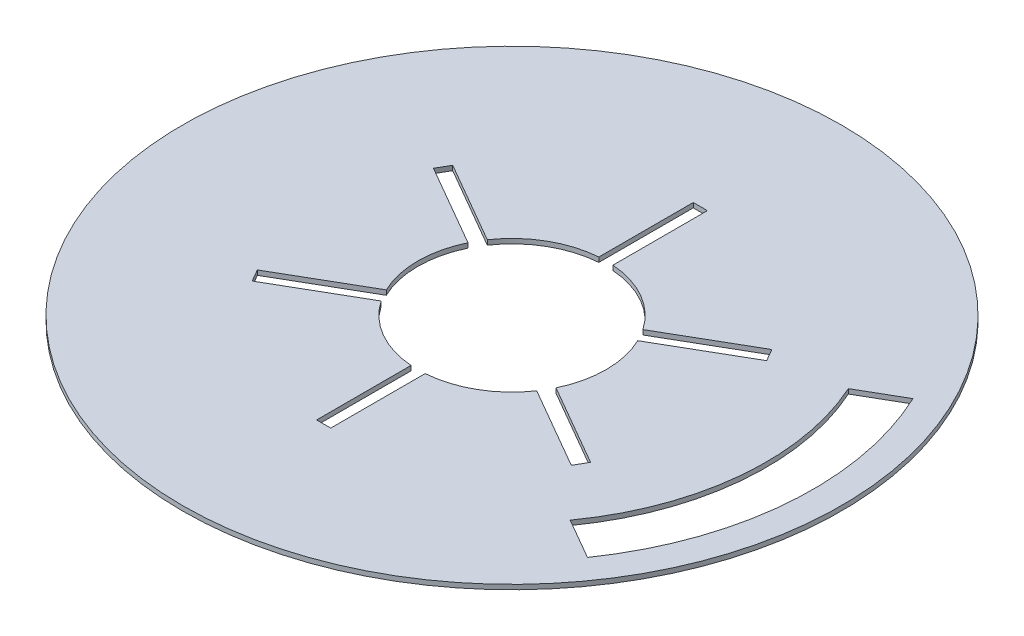
ISO-10303-21;
HEADER;
FILE_DESCRIPTION(('STEP AP214'),'2;1');
FILE_NAME('part.step','',(''),(''),'','','');
FILE_SCHEMA(('AUTOMOTIVE_DESIGN { 1 0 10303 214 1 1 1 1 }'));
ENDSEC;
DATA;
#1=APPLICATION_CONTEXT('core data for automotive mechanical design processes');
#2=APPLICATION_PROTOCOL_DEFINITION('international standard','automotive_design',2000,#1);
#3=PRODUCT_CONTEXT('',#1,'mechanical');
#4=PRODUCT('Part','Part','',(#3));
#5=PRODUCT_RELATED_PRODUCT_CATEGORY('part','',(#4));
#6=PRODUCT_DEFINITION_FORMATION('','',#4);
#7=PRODUCT_DEFINITION_CONTEXT('part definition',#1,'design');
#8=PRODUCT_DEFINITION('design','',#6,#7);
#9=PRODUCT_DEFINITION_SHAPE('','',#8);
#10=(LENGTH_UNIT() NAMED_UNIT(*) SI_UNIT(.MILLI.,.METRE.));
#11=(NAMED_UNIT(*) PLANE_ANGLE_UNIT() SI_UNIT($,.RADIAN.));
#12=(NAMED_UNIT(*) SI_UNIT($,.STERADIAN.) SOLID_ANGLE_UNIT());
#13=UNCERTAINTY_MEASURE_WITH_UNIT(LENGTH_MEASURE(1.E-05),#10,'distance_accuracy_value','');
#14=(GEOMETRIC_REPRESENTATION_CONTEXT(3) GLOBAL_UNCERTAINTY_ASSIGNED_CONTEXT((#13)) GLOBAL_UNIT_ASSIGNED_CONTEXT((#10,
#11,#12)) REPRESENTATION_CONTEXT('',''));
#15=CARTESIAN_POINT('',(0.,0.,0.));
#16=DIRECTION('',(0.,0.,1.));
#17=DIRECTION('',(1.,0.,0.));
#18=AXIS2_PLACEMENT_3D('',#15,#16,#17);
#19=CARTESIAN_POINT('',(13.3808283664911,5.,23.1762745781213));
#20=DIRECTION('',(-0.500000000000001,0.,-0.866025403784438));
#21=DIRECTION('',(-0.866025403784438,0.,0.500000000000001));
#22=AXIS2_PLACEMENT_3D('',#19,#20,#21);
#23=PLANE('',#22);
#24=DIRECTION('',(0.866025403784438,0.,-0.500000000000001));
#25=VECTOR('',#24,1.);
#26=CARTESIAN_POINT('',(13.3808283664911,0.,23.1762745781213));
#27=LINE('',#26,#25);
#28=CARTESIAN_POINT('',(246.056268189175,0.,-111.15895323732));
#29=VERTEX_POINT('',#28);
#30=CARTESIAN_POINT('',(289.538139145473,0.,-136.263223138808));
#31=VERTEX_POINT('',#30);
#32=EDGE_CURVE('E320',#29,#31,#27,.T.);
#33=ORIENTED_EDGE('',*,*,#32,.T.);
#34=DIRECTION('',(0.,-1.,0.));
#35=VECTOR('',#34,1.);
#36=CARTESIAN_POINT('',(289.538139145473,5.,-136.263223138808));
#37=LINE('',#36,#35);
#38=CARTESIAN_POINT('',(289.538139145473,5.,-136.263223138808));
#39=VERTEX_POINT('',#38);
#40=EDGE_CURVE('E11',#39,#31,#37,.T.);
#41=ORIENTED_EDGE('',*,*,#40,.F.);
#42=DIRECTION('',(0.866025403784438,0.,-0.500000000000001));
#43=VECTOR('',#42,1.);
#44=CARTESIAN_POINT('',(13.3808283664911,5.,23.1762745781213));
#45=LINE('',#44,#43);
#46=CARTESIAN_POINT('',(246.056268189175,5.,-111.15895323732));
#47=VERTEX_POINT('',#46);
#48=EDGE_CURVE('E234',#47,#39,#45,.T.);
#49=ORIENTED_EDGE('',*,*,#48,.F.);
#50=DIRECTION('',(0.,-1.,0.));
#51=VECTOR('',#50,1.);
#52=CARTESIAN_POINT('',(246.056268189175,5.,-111.15895323732));
#53=LINE('',#52,#51);
#54=EDGE_CURVE('E54',#47,#29,#53,.T.);
#55=ORIENTED_EDGE('',*,*,#54,.T.);
#56=EDGE_LOOP('',(#33,#41,#49,#55));
#57=FACE_BOUND('',#56,.T.);
#58=ADVANCED_FACE('F35',(#57),#23,.F.);
#59=CARTESIAN_POINT('',(0.,5.,0.));
#60=DIRECTION('',(0.,-1.,0.));
#61=DIRECTION('',(0.,0.,-1.));
#62=AXIS2_PLACEMENT_3D('',#59,#60,#61);
#63=CYLINDRICAL_SURFACE('',#62,320.);
#64=CARTESIAN_POINT('',(0.,0.,0.));
#65=DIRECTION('',(0.,1.,0.));
#66=DIRECTION('',(0.,0.,1.));
#67=AXIS2_PLACEMENT_3D('',#64,#65,#66);
#68=CIRCLE('',#67,320.);
#69=CARTESIAN_POINT('',(262.776482412492,0.,182.615772295049));
#70=VERTEX_POINT('',#69);
#71=EDGE_CURVE('E240',#31,#70,#68,.F.);
#72=ORIENTED_EDGE('',*,*,#71,.T.);
#73=DIRECTION('',(0.,-1.,0.));
#74=VECTOR('',#73,1.);
#75=CARTESIAN_POINT('',(262.776482412492,5.,182.615772295049));
#76=LINE('',#75,#74);
#77=CARTESIAN_POINT('',(262.776482412492,5.,182.615772295049));
#78=VERTEX_POINT('',#77);
#79=EDGE_CURVE('E45',#78,#70,#76,.T.);
#80=ORIENTED_EDGE('',*,*,#79,.F.);
#81=CARTESIAN_POINT('',(0.,5.,0.));
#82=DIRECTION('',(0.,1.,0.));
#83=DIRECTION('',(0.,0.,1.));
#84=AXIS2_PLACEMENT_3D('',#81,#82,#83);
#85=CIRCLE('',#84,320.);
#86=EDGE_CURVE('E228',#39,#78,#85,.F.);
#87=ORIENTED_EDGE('',*,*,#86,.F.);
#88=ORIENTED_EDGE('',*,*,#40,.T.);
#89=EDGE_LOOP('',(#72,#80,#87,#88));
#90=FACE_BOUND('',#89,.T.);
#91=ADVANCED_FACE('F239',(#90),#63,.F.);
#92=CARTESIAN_POINT('',(-13.3808283664908,5.,23.1762745781209));
#93=DIRECTION('',(0.5,0.,-0.866025403784439));
#94=DIRECTION('',(-0.866025403784439,0.,-0.5));
#95=AXIS2_PLACEMENT_3D('',#92,#93,#94);
#96=PLANE('',#95);
#97=DIRECTION('',(0.866025403784439,0.,0.5));
#98=VECTOR('',#97,1.);
#99=CARTESIAN_POINT('',(-13.3808283664908,0.,23.1762745781209));
#100=LINE('',#99,#98);
#101=CARTESIAN_POINT('',(219.294611456193,0.,157.511502393562));
#102=VERTEX_POINT('',#101);
#103=EDGE_CURVE('E323',#102,#70,#100,.T.);
#104=ORIENTED_EDGE('',*,*,#103,.F.);
#105=DIRECTION('',(0.,-1.,0.));
#106=VECTOR('',#105,1.);
#107=CARTESIAN_POINT('',(219.294611456193,5.,157.511502393562));
#108=LINE('',#107,#106);
#109=CARTESIAN_POINT('',(219.294611456193,5.,157.511502393562));
#110=VERTEX_POINT('',#109);
#111=EDGE_CURVE('E140',#110,#102,#108,.T.);
#112=ORIENTED_EDGE('',*,*,#111,.F.);
#113=DIRECTION('',(0.866025403784439,0.,0.5));
#114=VECTOR('',#113,1.);
#115=CARTESIAN_POINT('',(-13.3808283664908,5.,23.1762745781209));
#116=LINE('',#115,#114);
#117=EDGE_CURVE('E233',#110,#78,#116,.T.);
#118=ORIENTED_EDGE('',*,*,#117,.T.);
#119=ORIENTED_EDGE('',*,*,#79,.T.);
#120=EDGE_LOOP('',(#104,#112,#118,#119));
#121=FACE_BOUND('',#120,.T.);
#122=ADVANCED_FACE('F244',(#121),#96,.T.);
#123=CARTESIAN_POINT('',(0.,5.,0.));
#124=DIRECTION('',(0.,-1.,0.));
#125=DIRECTION('',(0.,0.,-1.));
#126=AXIS2_PLACEMENT_3D('',#123,#124,#125);
#127=CYLINDRICAL_SURFACE('',#126,100.);
#128=CARTESIAN_POINT('',(0.,0.,0.));
#129=DIRECTION('',(0.,1.,0.));
#130=DIRECTION('',(0.,0.,1.));
#131=AXIS2_PLACEMENT_3D('',#128,#129,#130);
#132=CIRCLE('',#131,100.);
#133=CARTESIAN_POINT('',(-82.6086272470793,0.,56.3543672163311));
#134=VERTEX_POINT('',#133);
#135=CARTESIAN_POINT('',(-7.5,0.,99.7183533758957));
#136=VERTEX_POINT('',#135);
#137=EDGE_CURVE('E251',#134,#136,#132,.T.);
#138=ORIENTED_EDGE('',*,*,#137,.F.);
#139=DIRECTION('',(0.,-1.,0.));
#140=VECTOR('',#139,1.);
#141=CARTESIAN_POINT('',(-82.6086272470793,5.,56.3543672163311));
#142=LINE('',#141,#140);
#143=CARTESIAN_POINT('',(-82.6086272470793,5.,56.3543672163311));
#144=VERTEX_POINT('',#143);
#145=EDGE_CURVE('E39',#144,#134,#142,.T.);
#146=ORIENTED_EDGE('',*,*,#145,.F.);
#147=CARTESIAN_POINT('',(0.,5.,0.));
#148=DIRECTION('',(0.,1.,0.));
#149=DIRECTION('',(0.,0.,1.));
#150=AXIS2_PLACEMENT_3D('',#147,#148,#149);
#151=CIRCLE('',#150,100.);
#152=CARTESIAN_POINT('',(-7.5,5.,99.7183533758957));
#153=VERTEX_POINT('',#152);
#154=EDGE_CURVE('E328',#144,#153,#151,.T.);
#155=ORIENTED_EDGE('',*,*,#154,.T.);
#156=DIRECTION('',(0.,-1.,0.));
#157=VECTOR('',#156,1.);
#158=CARTESIAN_POINT('',(-7.5,5.,99.7183533758957));
#159=LINE('',#158,#157);
#160=EDGE_CURVE('E247',#153,#136,#159,.T.);
#161=ORIENTED_EDGE('',*,*,#160,.T.);
#162=EDGE_LOOP('',(#138,#146,#155,#161));
#163=FACE_BOUND('',#162,.T.);
#164=ADVANCED_FACE('F37',(#163),#127,.F.);
#165=CARTESIAN_POINT('',(3.75000000000001,5.,6.4951905283833));
#166=DIRECTION('',(0.5,0.,0.866025403784438));
#167=DIRECTION('',(0.866025403784438,0.,-0.5));
#168=AXIS2_PLACEMENT_3D('',#165,#166,#167);
#169=PLANE('',#168);
#170=DIRECTION('',(-0.866025403784438,0.,0.5));
#171=VECTOR('',#170,1.);
#172=CARTESIAN_POINT('',(3.75000000000001,0.,6.4951905283833));
#173=LINE('',#172,#171);
#174=CARTESIAN_POINT('',(-169.455080756888,0.,106.495190528383));
#175=VERTEX_POINT('',#174);
#176=EDGE_CURVE('E254',#134,#175,#173,.T.);
#177=ORIENTED_EDGE('',*,*,#176,.T.);
#178=DIRECTION('',(0.,-1.,0.));
#179=VECTOR('',#178,1.);
#180=CARTESIAN_POINT('',(-169.455080756888,5.,106.495190528383));
#181=LINE('',#180,#179);
#182=CARTESIAN_POINT('',(-169.455080756888,5.,106.495190528383));
#183=VERTEX_POINT('',#182);
#184=EDGE_CURVE('E378',#183,#175,#181,.T.);
#185=ORIENTED_EDGE('',*,*,#184,.F.);
#186=DIRECTION('',(-0.866025403784438,0.,0.5));
#187=VECTOR('',#186,1.);
#188=CARTESIAN_POINT('',(3.75000000000001,5.,6.4951905283833));
#189=LINE('',#188,#187);
#190=EDGE_CURVE('E387',#144,#183,#189,.T.);
#191=ORIENTED_EDGE('',*,*,#190,.F.);
#192=ORIENTED_EDGE('',*,*,#145,.T.);
#193=EDGE_LOOP('',(#177,#185,#191,#192));
#194=FACE_BOUND('',#193,.T.);
#195=ADVANCED_FACE('F386',(#194),#169,.F.);
#196=CARTESIAN_POINT('',(-173.205080756888,5.,100.));
#197=DIRECTION('',(-0.866025403784438,0.,0.5));
#198=DIRECTION('',(0.5,0.,0.866025403784438));
#199=AXIS2_PLACEMENT_3D('',#196,#197,#198);
#200=PLANE('',#199);
#201=DIRECTION('',(-0.5,0.,-0.866025403784438));
#202=VECTOR('',#201,1.);
#203=CARTESIAN_POINT('',(-173.205080756888,0.,100.));
#204=LINE('',#203,#202);
#205=CARTESIAN_POINT('',(-176.955080756888,0.,93.5048094716168));
#206=VERTEX_POINT('',#205);
#207=EDGE_CURVE('E256',#175,#206,#204,.T.);
#208=ORIENTED_EDGE('',*,*,#207,.T.);
#209=DIRECTION('',(0.,-1.,0.));
#210=VECTOR('',#209,1.);
#211=CARTESIAN_POINT('',(-176.955080756888,5.,93.5048094716168));
#212=LINE('',#211,#210);
#213=CARTESIAN_POINT('',(-176.955080756888,5.,93.5048094716168));
#214=VERTEX_POINT('',#213);
#215=EDGE_CURVE('E377',#214,#206,#212,.T.);
#216=ORIENTED_EDGE('',*,*,#215,.F.);
#217=DIRECTION('',(-0.5,0.,-0.866025403784438));
#218=VECTOR('',#217,1.);
#219=CARTESIAN_POINT('',(-173.205080756888,5.,100.));
#220=LINE('',#219,#218);
#221=EDGE_CURVE('E833',#183,#214,#220,.T.);
#222=ORIENTED_EDGE('',*,*,#221,.F.);
#223=ORIENTED_EDGE('',*,*,#184,.T.);
#224=EDGE_LOOP('',(#208,#216,#222,#223));
#225=FACE_BOUND('',#224,.T.);
#226=ADVANCED_FACE('F517',(#225),#200,.F.);
#227=CARTESIAN_POINT('',(-3.75,5.,-6.49519052838328));
#228=DIRECTION('',(0.5,0.,0.866025403784438));
#229=DIRECTION('',(0.866025403784438,0.,-0.5));
#230=AXIS2_PLACEMENT_3D('',#227,#228,#229);
#231=PLANE('',#230);
#232=DIRECTION('',(-0.866025403784438,0.,0.5));
#233=VECTOR('',#232,1.);
#234=CARTESIAN_POINT('',(-3.75,0.,-6.49519052838328));
#235=LINE('',#234,#233);
#236=CARTESIAN_POINT('',(-90.1086272470794,0.,43.3639861595646));
#237=VERTEX_POINT('',#236);
#238=EDGE_CURVE('E259',#237,#206,#235,.T.);
#239=ORIENTED_EDGE('',*,*,#238,.F.);
#240=DIRECTION('',(0.,-1.,0.));
#241=VECTOR('',#240,1.);
#242=CARTESIAN_POINT('',(-90.1086272470794,5.,43.3639861595646));
#243=LINE('',#242,#241);
#244=CARTESIAN_POINT('',(-90.1086272470794,5.,43.3639861595646));
#245=VERTEX_POINT('',#244);
#246=EDGE_CURVE('E375',#245,#237,#243,.T.);
#247=ORIENTED_EDGE('',*,*,#246,.F.);
#248=DIRECTION('',(-0.866025403784438,0.,0.5));
#249=VECTOR('',#248,1.);
#250=CARTESIAN_POINT('',(-3.75,5.,-6.49519052838328));
#251=LINE('',#250,#249);
#252=EDGE_CURVE('E516',#245,#214,#251,.T.);
#253=ORIENTED_EDGE('',*,*,#252,.T.);
#254=ORIENTED_EDGE('',*,*,#215,.T.);
#255=EDGE_LOOP('',(#239,#247,#253,#254));
#256=FACE_BOUND('',#255,.T.);
#257=ADVANCED_FACE('F512',(#256),#231,.T.);
#258=CARTESIAN_POINT('',(0.,5.,0.));
#259=DIRECTION('',(0.,-1.,0.));
#260=DIRECTION('',(0.,0.,-1.));
#261=AXIS2_PLACEMENT_3D('',#258,#259,#260);
#262=CYLINDRICAL_SURFACE('',#261,100.);
#263=CARTESIAN_POINT('',(0.,0.,0.));
#264=DIRECTION('',(0.,1.,0.));
#265=DIRECTION('',(0.,0.,1.));
#266=AXIS2_PLACEMENT_3D('',#263,#264,#265);
#267=CIRCLE('',#266,100.);
#268=CARTESIAN_POINT('',(-90.1086272470794,0.,-43.3639861595645));
#269=VERTEX_POINT('',#268);
#270=EDGE_CURVE('E262',#269,#237,#267,.T.);
#271=ORIENTED_EDGE('',*,*,#270,.F.);
#272=DIRECTION('',(0.,-1.,0.));
#273=VECTOR('',#272,1.);
#274=CARTESIAN_POINT('',(-90.1086272470794,5.,-43.3639861595645));
#275=LINE('',#274,#273);
#276=CARTESIAN_POINT('',(-90.1086272470794,5.,-43.3639861595645));
#277=VERTEX_POINT('',#276);
#278=EDGE_CURVE('E373',#277,#269,#275,.T.);
#279=ORIENTED_EDGE('',*,*,#278,.F.);
#280=CARTESIAN_POINT('',(0.,5.,0.));
#281=DIRECTION('',(0.,1.,0.));
#282=DIRECTION('',(0.,0.,1.));
#283=AXIS2_PLACEMENT_3D('',#280,#281,#282);
#284=CIRCLE('',#283,100.);
#285=EDGE_CURVE('E509',#277,#245,#284,.T.);
#286=ORIENTED_EDGE('',*,*,#285,.T.);
#287=ORIENTED_EDGE('',*,*,#246,.T.);
#288=EDGE_LOOP('',(#271,#279,#286,#287));
#289=FACE_BOUND('',#288,.T.);
#290=ADVANCED_FACE('F508',(#289),#262,.F.);
#291=CARTESIAN_POINT('',(-3.75,5.,6.4951905283833));
#292=DIRECTION('',(-0.499999999999999,0.,0.866025403784439));
#293=DIRECTION('',(0.866025403784439,0.,0.499999999999999));
#294=AXIS2_PLACEMENT_3D('',#291,#292,#293);
#295=PLANE('',#294);
#296=DIRECTION('',(-0.866025403784439,0.,-0.499999999999999));
#297=VECTOR('',#296,1.);
#298=CARTESIAN_POINT('',(-3.75,0.,6.4951905283833));
#299=LINE('',#298,#297);
#300=CARTESIAN_POINT('',(-176.955080756888,0.,-93.5048094716166));
#301=VERTEX_POINT('',#300);
#302=EDGE_CURVE('E265',#269,#301,#299,.T.);
#303=ORIENTED_EDGE('',*,*,#302,.T.);
#304=DIRECTION('',(0.,-1.,0.));
#305=VECTOR('',#304,1.);
#306=CARTESIAN_POINT('',(-176.955080756888,5.,-93.5048094716166));
#307=LINE('',#306,#305);
#308=CARTESIAN_POINT('',(-176.955080756888,5.,-93.5048094716166));
#309=VERTEX_POINT('',#308);
#310=EDGE_CURVE('E370',#309,#301,#307,.T.);
#311=ORIENTED_EDGE('',*,*,#310,.F.);
#312=DIRECTION('',(-0.866025403784439,0.,-0.499999999999999));
#313=VECTOR('',#312,1.);
#314=CARTESIAN_POINT('',(-3.75,5.,6.4951905283833));
#315=LINE('',#314,#313);
#316=EDGE_CURVE('E504',#277,#309,#315,.T.);
#317=ORIENTED_EDGE('',*,*,#316,.F.);
#318=ORIENTED_EDGE('',*,*,#278,.T.);
#319=EDGE_LOOP('',(#303,#311,#317,#318));
#320=FACE_BOUND('',#319,.T.);
#321=ADVANCED_FACE('F503',(#320),#295,.F.);
#322=CARTESIAN_POINT('',(-173.205080756888,5.,-100.));
#323=DIRECTION('',(-0.866025403784439,0.,-0.5));
#324=DIRECTION('',(-0.5,0.,0.866025403784439));
#325=AXIS2_PLACEMENT_3D('',#322,#323,#324);
#326=PLANE('',#325);
#327=DIRECTION('',(0.5,0.,-0.866025403784439));
#328=VECTOR('',#327,1.);
#329=CARTESIAN_POINT('',(-173.205080756888,0.,-100.));
#330=LINE('',#329,#328);
#331=CARTESIAN_POINT('',(-169.455080756888,0.,-106.495190528383));
#332=VERTEX_POINT('',#331);
#333=EDGE_CURVE('E267',#301,#332,#330,.T.);
#334=ORIENTED_EDGE('',*,*,#333,.T.);
#335=DIRECTION('',(0.,-1.,0.));
#336=VECTOR('',#335,1.);
#337=CARTESIAN_POINT('',(-169.455080756888,5.,-106.495190528383));
#338=LINE('',#337,#336);
#339=CARTESIAN_POINT('',(-169.455080756888,5.,-106.495190528383));
#340=VERTEX_POINT('',#339);
#341=EDGE_CURVE('E368',#340,#332,#338,.T.);
#342=ORIENTED_EDGE('',*,*,#341,.F.);
#343=DIRECTION('',(0.5,0.,-0.866025403784439));
#344=VECTOR('',#343,1.);
#345=CARTESIAN_POINT('',(-173.205080756888,5.,-100.));
#346=LINE('',#345,#344);
#347=EDGE_CURVE('E500',#309,#340,#346,.T.);
#348=ORIENTED_EDGE('',*,*,#347,.F.);
#349=ORIENTED_EDGE('',*,*,#310,.T.);
#350=EDGE_LOOP('',(#334,#342,#348,#349));
#351=FACE_BOUND('',#350,.T.);
#352=ADVANCED_FACE('F497',(#351),#326,.F.);
#353=CARTESIAN_POINT('',(3.75000000000001,5.,-6.49519052838332));
#354=DIRECTION('',(-0.499999999999999,0.,0.866025403784439));
#355=DIRECTION('',(0.866025403784439,0.,0.499999999999999));
#356=AXIS2_PLACEMENT_3D('',#353,#354,#355);
#357=PLANE('',#356);
#358=DIRECTION('',(-0.866025403784439,0.,-0.499999999999999));
#359=VECTOR('',#358,1.);
#360=CARTESIAN_POINT('',(3.75000000000001,0.,-6.49519052838332));
#361=LINE('',#360,#359);
#362=CARTESIAN_POINT('',(-82.6086272470794,0.,-56.3543672163311));
#363=VERTEX_POINT('',#362);
#364=EDGE_CURVE('E270',#363,#332,#361,.T.);
#365=ORIENTED_EDGE('',*,*,#364,.F.);
#366=DIRECTION('',(0.,-1.,0.));
#367=VECTOR('',#366,1.);
#368=CARTESIAN_POINT('',(-82.6086272470794,5.,-56.3543672163311));
#369=LINE('',#368,#367);
#370=CARTESIAN_POINT('',(-82.6086272470794,5.,-56.3543672163311));
#371=VERTEX_POINT('',#370);
#372=EDGE_CURVE('E366',#371,#363,#369,.T.);
#373=ORIENTED_EDGE('',*,*,#372,.F.);
#374=DIRECTION('',(-0.866025403784439,0.,-0.499999999999999));
#375=VECTOR('',#374,1.);
#376=CARTESIAN_POINT('',(3.75000000000001,5.,-6.49519052838332));
#377=LINE('',#376,#375);
#378=EDGE_CURVE('E827',#371,#340,#377,.T.);
#379=ORIENTED_EDGE('',*,*,#378,.T.);
#380=ORIENTED_EDGE('',*,*,#341,.T.);
#381=EDGE_LOOP('',(#365,#373,#379,#380));
#382=FACE_BOUND('',#381,.T.);
#383=ADVANCED_FACE('F491',(#382),#357,.T.);
#384=CARTESIAN_POINT('',(0.,5.,0.));
#385=DIRECTION('',(0.,-1.,0.));
#386=DIRECTION('',(0.,0.,-1.));
#387=AXIS2_PLACEMENT_3D('',#384,#385,#386);
#388=CYLINDRICAL_SURFACE('',#387,100.);
#389=CARTESIAN_POINT('',(0.,0.,0.));
#390=DIRECTION('',(0.,1.,0.));
#391=DIRECTION('',(0.,0.,1.));
#392=AXIS2_PLACEMENT_3D('',#389,#390,#391);
#393=CIRCLE('',#392,100.);
#394=CARTESIAN_POINT('',(-7.5,0.,-99.7183533758957));
#395=VERTEX_POINT('',#394);
#396=EDGE_CURVE('E273',#395,#363,#393,.T.);
#397=ORIENTED_EDGE('',*,*,#396,.F.);
#398=DIRECTION('',(0.,-1.,0.));
#399=VECTOR('',#398,1.);
#400=CARTESIAN_POINT('',(-7.5,5.,-99.7183533758957));
#401=LINE('',#400,#399);
#402=CARTESIAN_POINT('',(-7.5,5.,-99.7183533758957));
#403=VERTEX_POINT('',#402);
#404=EDGE_CURVE('E364',#403,#395,#401,.T.);
#405=ORIENTED_EDGE('',*,*,#404,.F.);
#406=CARTESIAN_POINT('',(0.,5.,0.));
#407=DIRECTION('',(0.,1.,0.));
#408=DIRECTION('',(0.,0.,1.));
#409=AXIS2_PLACEMENT_3D('',#406,#407,#408);
#410=CIRCLE('',#409,100.);
#411=EDGE_CURVE('E487',#403,#371,#410,.T.);
#412=ORIENTED_EDGE('',*,*,#411,.T.);
#413=ORIENTED_EDGE('',*,*,#372,.T.);
#414=EDGE_LOOP('',(#397,#405,#412,#413));
#415=FACE_BOUND('',#414,.T.);
#416=ADVANCED_FACE('F484',(#415),#388,.F.);
#417=CARTESIAN_POINT('',(-7.5,5.,0.));
#418=DIRECTION('',(-1.,0.,0.));
#419=DIRECTION('',(0.,0.,1.));
#420=AXIS2_PLACEMENT_3D('',#417,#418,#419);
#421=PLANE('',#420);
#422=DIRECTION('',(0.,0.,-1.));
#423=VECTOR('',#422,1.);
#424=CARTESIAN_POINT('',(-7.5,0.,0.));
#425=LINE('',#424,#423);
#426=CARTESIAN_POINT('',(-7.5,0.,-200.));
#427=VERTEX_POINT('',#426);
#428=EDGE_CURVE('E276',#395,#427,#425,.T.);
#429=ORIENTED_EDGE('',*,*,#428,.T.);
#430=DIRECTION('',(0.,-1.,0.));
#431=VECTOR('',#430,1.);
#432=CARTESIAN_POINT('',(-7.5,5.,-200.));
#433=LINE('',#432,#431);
#434=CARTESIAN_POINT('',(-7.5,5.,-200.));
#435=VERTEX_POINT('',#434);
#436=EDGE_CURVE('E361',#435,#427,#433,.T.);
#437=ORIENTED_EDGE('',*,*,#436,.F.);
#438=DIRECTION('',(0.,0.,-1.));
#439=VECTOR('',#438,1.);
#440=CARTESIAN_POINT('',(-7.5,5.,0.));
#441=LINE('',#440,#439);
#442=EDGE_CURVE('E480',#403,#435,#441,.T.);
#443=ORIENTED_EDGE('',*,*,#442,.F.);
#444=ORIENTED_EDGE('',*,*,#404,.T.);
#445=EDGE_LOOP('',(#429,#437,#443,#444));
#446=FACE_BOUND('',#445,.T.);
#447=ADVANCED_FACE('F479',(#446),#421,.F.);
#448=CARTESIAN_POINT('',(0.,5.,-200.));
#449=DIRECTION('',(0.,0.,-1.));
#450=DIRECTION('',(-1.,0.,0.));
#451=AXIS2_PLACEMENT_3D('',#448,#449,#450);
#452=PLANE('',#451);
#453=DIRECTION('',(1.,0.,0.));
#454=VECTOR('',#453,1.);
#455=CARTESIAN_POINT('',(0.,0.,-200.));
#456=LINE('',#455,#454);
#457=CARTESIAN_POINT('',(7.5,0.,-200.));
#458=VERTEX_POINT('',#457);
#459=EDGE_CURVE('E278',#427,#458,#456,.T.);
#460=ORIENTED_EDGE('',*,*,#459,.T.);
#461=DIRECTION('',(0.,-1.,0.));
#462=VECTOR('',#461,1.);
#463=CARTESIAN_POINT('',(7.5,5.,-200.));
#464=LINE('',#463,#462);
#465=CARTESIAN_POINT('',(7.5,5.,-200.));
#466=VERTEX_POINT('',#465);
#467=EDGE_CURVE('E359',#466,#458,#464,.T.);
#468=ORIENTED_EDGE('',*,*,#467,.F.);
#469=DIRECTION('',(1.,0.,0.));
#470=VECTOR('',#469,1.);
#471=CARTESIAN_POINT('',(0.,5.,-200.));
#472=LINE('',#471,#470);
#473=EDGE_CURVE('E476',#435,#466,#472,.T.);
#474=ORIENTED_EDGE('',*,*,#473,.F.);
#475=ORIENTED_EDGE('',*,*,#436,.T.);
#476=EDGE_LOOP('',(#460,#468,#474,#475));
#477=FACE_BOUND('',#476,.T.);
#478=ADVANCED_FACE('F474',(#477),#452,.F.);
#479=CARTESIAN_POINT('',(7.50000000000005,5.,0.));
#480=DIRECTION('',(-1.,0.,0.));
#481=DIRECTION('',(0.,0.,1.));
#482=AXIS2_PLACEMENT_3D('',#479,#480,#481);
#483=PLANE('',#482);
#484=DIRECTION('',(0.,0.,-1.));
#485=VECTOR('',#484,1.);
#486=CARTESIAN_POINT('',(7.50000000000005,0.,0.));
#487=LINE('',#486,#485);
#488=CARTESIAN_POINT('',(7.50000000000002,0.,-99.7183533758957));
#489=VERTEX_POINT('',#488);
#490=EDGE_CURVE('E281',#489,#458,#487,.T.);
#491=ORIENTED_EDGE('',*,*,#490,.F.);
#492=DIRECTION('',(0.,-1.,0.));
#493=VECTOR('',#492,1.);
#494=CARTESIAN_POINT('',(7.50000000000002,5.,-99.7183533758957));
#495=LINE('',#494,#493);
#496=CARTESIAN_POINT('',(7.50000000000002,5.,-99.7183533758957));
#497=VERTEX_POINT('',#496);
#498=EDGE_CURVE('E357',#497,#489,#495,.T.);
#499=ORIENTED_EDGE('',*,*,#498,.F.);
#500=DIRECTION('',(0.,0.,-1.));
#501=VECTOR('',#500,1.);
#502=CARTESIAN_POINT('',(7.50000000000005,5.,0.));
#503=LINE('',#502,#501);
#504=EDGE_CURVE('E471',#497,#466,#503,.T.);
#505=ORIENTED_EDGE('',*,*,#504,.T.);
#506=ORIENTED_EDGE('',*,*,#467,.T.);
#507=EDGE_LOOP('',(#491,#499,#505,#506));
#508=FACE_BOUND('',#507,.T.);
#509=ADVANCED_FACE('F467',(#508),#483,.T.);
#510=CARTESIAN_POINT('',(0.,5.,0.));
#511=DIRECTION('',(0.,-1.,0.));
#512=DIRECTION('',(0.,0.,-1.));
#513=AXIS2_PLACEMENT_3D('',#510,#511,#512);
#514=CYLINDRICAL_SURFACE('',#513,100.);
#515=CARTESIAN_POINT('',(0.,0.,0.));
#516=DIRECTION('',(0.,1.,0.));
#517=DIRECTION('',(0.,0.,1.));
#518=AXIS2_PLACEMENT_3D('',#515,#516,#517);
#519=CIRCLE('',#518,100.);
#520=CARTESIAN_POINT('',(82.6086272470794,0.,-56.354367216331));
#521=VERTEX_POINT('',#520);
#522=EDGE_CURVE('E284',#521,#489,#519,.T.);
#523=ORIENTED_EDGE('',*,*,#522,.F.);
#524=DIRECTION('',(0.,-1.,0.));
#525=VECTOR('',#524,1.);
#526=CARTESIAN_POINT('',(82.6086272470794,5.,-56.354367216331));
#527=LINE('',#526,#525);
#528=CARTESIAN_POINT('',(82.6086272470794,5.,-56.354367216331));
#529=VERTEX_POINT('',#528);
#530=EDGE_CURVE('E355',#529,#521,#527,.T.);
#531=ORIENTED_EDGE('',*,*,#530,.F.);
#532=CARTESIAN_POINT('',(0.,5.,0.));
#533=DIRECTION('',(0.,1.,0.));
#534=DIRECTION('',(0.,0.,1.));
#535=AXIS2_PLACEMENT_3D('',#532,#533,#534);
#536=CIRCLE('',#535,100.);
#537=EDGE_CURVE('E462',#529,#497,#536,.T.);
#538=ORIENTED_EDGE('',*,*,#537,.T.);
#539=ORIENTED_EDGE('',*,*,#498,.T.);
#540=EDGE_LOOP('',(#523,#531,#538,#539));
#541=FACE_BOUND('',#540,.T.);
#542=ADVANCED_FACE('F461',(#541),#514,.F.);
#543=CARTESIAN_POINT('',(-3.7499999999999,5.,-6.49519052838311));
#544=DIRECTION('',(-0.500000000000001,0.,-0.866025403784438));
#545=DIRECTION('',(-0.866025403784438,0.,0.500000000000001));
#546=AXIS2_PLACEMENT_3D('',#543,#544,#545);
#547=PLANE('',#546);
#548=DIRECTION('',(0.866025403784438,0.,-0.500000000000001));
#549=VECTOR('',#548,1.);
#550=CARTESIAN_POINT('',(-3.7499999999999,0.,-6.49519052838311));
#551=LINE('',#550,#549);
#552=CARTESIAN_POINT('',(169.455080756888,0.,-106.495190528383));
#553=VERTEX_POINT('',#552);
#554=EDGE_CURVE('E287',#521,#553,#551,.T.);
#555=ORIENTED_EDGE('',*,*,#554,.T.);
#556=DIRECTION('',(0.,-1.,0.));
#557=VECTOR('',#556,1.);
#558=CARTESIAN_POINT('',(169.455080756888,5.,-106.495190528383));
#559=LINE('',#558,#557);
#560=CARTESIAN_POINT('',(169.455080756888,5.,-106.495190528383));
#561=VERTEX_POINT('',#560);
#562=EDGE_CURVE('E352',#561,#553,#559,.T.);
#563=ORIENTED_EDGE('',*,*,#562,.F.);
#564=DIRECTION('',(0.866025403784438,0.,-0.500000000000001));
#565=VECTOR('',#564,1.);
#566=CARTESIAN_POINT('',(-3.7499999999999,5.,-6.49519052838311));
#567=LINE('',#566,#565);
#568=EDGE_CURVE('E457',#529,#561,#567,.T.);
#569=ORIENTED_EDGE('',*,*,#568,.F.);
#570=ORIENTED_EDGE('',*,*,#530,.T.);
#571=EDGE_LOOP('',(#555,#563,#569,#570));
#572=FACE_BOUND('',#571,.T.);
#573=ADVANCED_FACE('F456',(#572),#547,.F.);
#574=CARTESIAN_POINT('',(173.205080756888,5.,-100.));
#575=DIRECTION('',(0.866025403784439,0.,-0.5));
#576=DIRECTION('',(-0.5,0.,-0.866025403784439));
#577=AXIS2_PLACEMENT_3D('',#574,#575,#576);
#578=PLANE('',#577);
#579=DIRECTION('',(0.5,0.,0.866025403784439));
#580=VECTOR('',#579,1.);
#581=CARTESIAN_POINT('',(173.205080756888,0.,-100.));
#582=LINE('',#581,#580);
#583=CARTESIAN_POINT('',(176.955080756888,0.,-93.5048094716167));
#584=VERTEX_POINT('',#583);
#585=EDGE_CURVE('E289',#553,#584,#582,.T.);
#586=ORIENTED_EDGE('',*,*,#585,.T.);
#587=DIRECTION('',(0.,-1.,0.));
#588=VECTOR('',#587,1.);
#589=CARTESIAN_POINT('',(176.955080756888,5.,-93.5048094716167));
#590=LINE('',#589,#588);
#591=CARTESIAN_POINT('',(176.955080756888,5.,-93.5048094716167));
#592=VERTEX_POINT('',#591);
#593=EDGE_CURVE('E350',#592,#584,#590,.T.);
#594=ORIENTED_EDGE('',*,*,#593,.F.);
#595=DIRECTION('',(0.5,0.,0.866025403784439));
#596=VECTOR('',#595,1.);
#597=CARTESIAN_POINT('',(173.205080756888,5.,-100.));
#598=LINE('',#597,#596);
#599=EDGE_CURVE('E453',#561,#592,#598,.T.);
#600=ORIENTED_EDGE('',*,*,#599,.F.);
#601=ORIENTED_EDGE('',*,*,#562,.T.);
#602=EDGE_LOOP('',(#586,#594,#600,#601));
#603=FACE_BOUND('',#602,.T.);
#604=ADVANCED_FACE('F450',(#603),#578,.F.);
#605=CARTESIAN_POINT('',(3.75000000000003,5.,6.49519052838333));
#606=DIRECTION('',(-0.5,0.,-0.866025403784438));
#607=DIRECTION('',(-0.866025403784438,0.,0.5));
#608=AXIS2_PLACEMENT_3D('',#605,#606,#607);
#609=PLANE('',#608);
#610=DIRECTION('',(0.866025403784438,0.,-0.5));
#611=VECTOR('',#610,1.);
#612=CARTESIAN_POINT('',(3.75000000000003,0.,6.49519052838333));
#613=LINE('',#612,#611);
#614=CARTESIAN_POINT('',(90.1086272470794,0.,-43.3639861595645));
#615=VERTEX_POINT('',#614);
#616=EDGE_CURVE('E292',#615,#584,#613,.T.);
#617=ORIENTED_EDGE('',*,*,#616,.F.);
#618=DIRECTION('',(0.,-1.,0.));
#619=VECTOR('',#618,1.);
#620=CARTESIAN_POINT('',(90.1086272470794,5.,-43.3639861595645));
#621=LINE('',#620,#619);
#622=CARTESIAN_POINT('',(90.1086272470794,5.,-43.3639861595645));
#623=VERTEX_POINT('',#622);
#624=EDGE_CURVE('E348',#623,#615,#621,.T.);
#625=ORIENTED_EDGE('',*,*,#624,.F.);
#626=DIRECTION('',(0.866025403784438,0.,-0.5));
#627=VECTOR('',#626,1.);
#628=CARTESIAN_POINT('',(3.75000000000003,5.,6.49519052838333));
#629=LINE('',#628,#627);
#630=EDGE_CURVE('E818',#623,#592,#629,.T.);
#631=ORIENTED_EDGE('',*,*,#630,.T.);
#632=ORIENTED_EDGE('',*,*,#593,.T.);
#633=EDGE_LOOP('',(#617,#625,#631,#632));
#634=FACE_BOUND('',#633,.T.);
#635=ADVANCED_FACE('F444',(#634),#609,.T.);
#636=CARTESIAN_POINT('',(0.,5.,0.));
#637=DIRECTION('',(0.,-1.,0.));
#638=DIRECTION('',(0.,0.,-1.));
#639=AXIS2_PLACEMENT_3D('',#636,#637,#638);
#640=CYLINDRICAL_SURFACE('',#639,100.);
#641=CARTESIAN_POINT('',(0.,0.,0.));
#642=DIRECTION('',(0.,1.,0.));
#643=DIRECTION('',(0.,0.,1.));
#644=AXIS2_PLACEMENT_3D('',#641,#642,#643);
#645=CIRCLE('',#644,100.);
#646=CARTESIAN_POINT('',(90.1086272470793,0.,43.3639861595646));
#647=VERTEX_POINT('',#646);
#648=EDGE_CURVE('E295',#647,#615,#645,.T.);
#649=ORIENTED_EDGE('',*,*,#648,.F.);
#650=DIRECTION('',(0.,-1.,0.));
#651=VECTOR('',#650,1.);
#652=CARTESIAN_POINT('',(90.1086272470793,5.,43.3639861595646));
#653=LINE('',#652,#651);
#654=CARTESIAN_POINT('',(90.1086272470793,5.,43.3639861595646));
#655=VERTEX_POINT('',#654);
#656=EDGE_CURVE('E346',#655,#647,#653,.T.);
#657=ORIENTED_EDGE('',*,*,#656,.F.);
#658=CARTESIAN_POINT('',(0.,5.,0.));
#659=DIRECTION('',(0.,1.,0.));
#660=DIRECTION('',(0.,0.,1.));
#661=AXIS2_PLACEMENT_3D('',#658,#659,#660);
#662=CIRCLE('',#661,100.);
#663=EDGE_CURVE('E440',#655,#623,#662,.T.);
#664=ORIENTED_EDGE('',*,*,#663,.T.);
#665=ORIENTED_EDGE('',*,*,#624,.T.);
#666=EDGE_LOOP('',(#649,#657,#664,#665));
#667=FACE_BOUND('',#666,.T.);
#668=ADVANCED_FACE('F437',(#667),#640,.F.);
#669=CARTESIAN_POINT('',(3.74999999999989,5.,-6.49519052838312));
#670=DIRECTION('',(0.499999999999999,0.,-0.866025403784439));
#671=DIRECTION('',(-0.866025403784439,0.,-0.499999999999999));
#672=AXIS2_PLACEMENT_3D('',#669,#670,#671);
#673=PLANE('',#672);
#674=DIRECTION('',(0.866025403784439,0.,0.499999999999999));
#675=VECTOR('',#674,1.);
#676=CARTESIAN_POINT('',(3.74999999999989,0.,-6.49519052838312));
#677=LINE('',#676,#675);
#678=CARTESIAN_POINT('',(176.955080756888,0.,93.5048094716167));
#679=VERTEX_POINT('',#678);
#680=EDGE_CURVE('E298',#647,#679,#677,.T.);
#681=ORIENTED_EDGE('',*,*,#680,.T.);
#682=DIRECTION('',(0.,-1.,0.));
#683=VECTOR('',#682,1.);
#684=CARTESIAN_POINT('',(176.955080756888,5.,93.5048094716167));
#685=LINE('',#684,#683);
#686=CARTESIAN_POINT('',(176.955080756888,5.,93.5048094716167));
#687=VERTEX_POINT('',#686);
#688=EDGE_CURVE('E343',#687,#679,#685,.T.);
#689=ORIENTED_EDGE('',*,*,#688,.F.);
#690=DIRECTION('',(0.866025403784439,0.,0.499999999999999));
#691=VECTOR('',#690,1.);
#692=CARTESIAN_POINT('',(3.74999999999989,5.,-6.49519052838312));
#693=LINE('',#692,#691);
#694=EDGE_CURVE('E433',#655,#687,#693,.T.);
#695=ORIENTED_EDGE('',*,*,#694,.F.);
#696=ORIENTED_EDGE('',*,*,#656,.T.);
#697=EDGE_LOOP('',(#681,#689,#695,#696));
#698=FACE_BOUND('',#697,.T.);
#699=ADVANCED_FACE('F432',(#698),#673,.F.);
#700=CARTESIAN_POINT('',(173.205080756888,5.,100.));
#701=DIRECTION('',(0.866025403784439,0.,0.5));
#702=DIRECTION('',(0.5,0.,-0.866025403784439));
#703=AXIS2_PLACEMENT_3D('',#700,#701,#702);
#704=PLANE('',#703);
#705=DIRECTION('',(-0.5,0.,0.866025403784439));
#706=VECTOR('',#705,1.);
#707=CARTESIAN_POINT('',(173.205080756888,0.,100.));
#708=LINE('',#707,#706);
#709=CARTESIAN_POINT('',(169.455080756888,0.,106.495190528383));
#710=VERTEX_POINT('',#709);
#711=EDGE_CURVE('E300',#679,#710,#708,.T.);
#712=ORIENTED_EDGE('',*,*,#711,.T.);
#713=DIRECTION('',(0.,-1.,0.));
#714=VECTOR('',#713,1.);
#715=CARTESIAN_POINT('',(169.455080756888,5.,106.495190528383));
#716=LINE('',#715,#714);
#717=CARTESIAN_POINT('',(169.455080756888,5.,106.495190528383));
#718=VERTEX_POINT('',#717);
#719=EDGE_CURVE('E341',#718,#710,#716,.T.);
#720=ORIENTED_EDGE('',*,*,#719,.F.);
#721=DIRECTION('',(-0.5,0.,0.866025403784439));
#722=VECTOR('',#721,1.);
#723=CARTESIAN_POINT('',(173.205080756888,5.,100.));
#724=LINE('',#723,#722);
#725=EDGE_CURVE('E429',#687,#718,#724,.T.);
#726=ORIENTED_EDGE('',*,*,#725,.F.);
#727=ORIENTED_EDGE('',*,*,#688,.T.);
#728=EDGE_LOOP('',(#712,#720,#726,#727));
#729=FACE_BOUND('',#728,.T.);
#730=ADVANCED_FACE('F427',(#729),#704,.F.);
#731=CARTESIAN_POINT('',(-3.75000000000003,5.,6.49519052838335));
#732=DIRECTION('',(0.5,0.,-0.866025403784439));
#733=DIRECTION('',(-0.866025403784439,0.,-0.5));
#734=AXIS2_PLACEMENT_3D('',#731,#732,#733);
#735=PLANE('',#734);
#736=DIRECTION('',(0.866025403784439,0.,0.5));
#737=VECTOR('',#736,1.);
#738=CARTESIAN_POINT('',(-3.75000000000003,0.,6.49519052838335));
#739=LINE('',#738,#737);
#740=CARTESIAN_POINT('',(82.6086272470794,0.,56.3543672163311));
#741=VERTEX_POINT('',#740);
#742=EDGE_CURVE('E303',#741,#710,#739,.T.);
#743=ORIENTED_EDGE('',*,*,#742,.F.);
#744=DIRECTION('',(0.,-1.,0.));
#745=VECTOR('',#744,1.);
#746=CARTESIAN_POINT('',(82.6086272470794,5.,56.3543672163311));
#747=LINE('',#746,#745);
#748=CARTESIAN_POINT('',(82.6086272470794,5.,56.3543672163311));
#749=VERTEX_POINT('',#748);
#750=EDGE_CURVE('E339',#749,#741,#747,.T.);
#751=ORIENTED_EDGE('',*,*,#750,.F.);
#752=DIRECTION('',(0.866025403784439,0.,0.5));
#753=VECTOR('',#752,1.);
#754=CARTESIAN_POINT('',(-3.75000000000003,5.,6.49519052838335));
#755=LINE('',#754,#753);
#756=EDGE_CURVE('E424',#749,#718,#755,.T.);
#757=ORIENTED_EDGE('',*,*,#756,.T.);
#758=ORIENTED_EDGE('',*,*,#719,.T.);
#759=EDGE_LOOP('',(#743,#751,#757,#758));
#760=FACE_BOUND('',#759,.T.);
#761=ADVANCED_FACE('F420',(#760),#735,.T.);
#762=CARTESIAN_POINT('',(0.,5.,0.));
#763=DIRECTION('',(0.,-1.,0.));
#764=DIRECTION('',(0.,0.,-1.));
#765=AXIS2_PLACEMENT_3D('',#762,#763,#764);
#766=CYLINDRICAL_SURFACE('',#765,100.);
#767=CARTESIAN_POINT('',(0.,0.,0.));
#768=DIRECTION('',(0.,1.,0.));
#769=DIRECTION('',(0.,0.,1.));
#770=AXIS2_PLACEMENT_3D('',#767,#768,#769);
#771=CIRCLE('',#770,100.);
#772=CARTESIAN_POINT('',(7.50000000000002,0.,99.7183533758957));
#773=VERTEX_POINT('',#772);
#774=EDGE_CURVE('E306',#773,#741,#771,.T.);
#775=ORIENTED_EDGE('',*,*,#774,.F.);
#776=DIRECTION('',(0.,-1.,0.));
#777=VECTOR('',#776,1.);
#778=CARTESIAN_POINT('',(7.50000000000002,5.,99.7183533758957));
#779=LINE('',#778,#777);
#780=CARTESIAN_POINT('',(7.50000000000002,5.,99.7183533758957));
#781=VERTEX_POINT('',#780);
#782=EDGE_CURVE('E337',#781,#773,#779,.T.);
#783=ORIENTED_EDGE('',*,*,#782,.F.);
#784=CARTESIAN_POINT('',(0.,5.,0.));
#785=DIRECTION('',(0.,1.,0.));
#786=DIRECTION('',(0.,0.,1.));
#787=AXIS2_PLACEMENT_3D('',#784,#785,#786);
#788=CIRCLE('',#787,100.);
#789=EDGE_CURVE('E415',#781,#749,#788,.T.);
#790=ORIENTED_EDGE('',*,*,#789,.T.);
#791=ORIENTED_EDGE('',*,*,#750,.T.);
#792=EDGE_LOOP('',(#775,#783,#790,#791));
#793=FACE_BOUND('',#792,.T.);
#794=ADVANCED_FACE('F414',(#793),#766,.F.);
#795=CARTESIAN_POINT('',(7.50000000000002,5.,0.));
#796=DIRECTION('',(1.,0.,0.));
#797=DIRECTION('',(0.,0.,-1.));
#798=AXIS2_PLACEMENT_3D('',#795,#796,#797);
#799=PLANE('',#798);
#800=DIRECTION('',(0.,0.,1.));
#801=VECTOR('',#800,1.);
#802=CARTESIAN_POINT('',(7.50000000000002,0.,0.));
#803=LINE('',#802,#801);
#804=CARTESIAN_POINT('',(7.50000000000002,0.,200.));
#805=VERTEX_POINT('',#804);
#806=EDGE_CURVE('E309',#773,#805,#803,.T.);
#807=ORIENTED_EDGE('',*,*,#806,.T.);
#808=DIRECTION('',(0.,-1.,0.));
#809=VECTOR('',#808,1.);
#810=CARTESIAN_POINT('',(7.50000000000002,5.,200.));
#811=LINE('',#810,#809);
#812=CARTESIAN_POINT('',(7.50000000000002,5.,200.));
#813=VERTEX_POINT('',#812);
#814=EDGE_CURVE('E334',#813,#805,#811,.T.);
#815=ORIENTED_EDGE('',*,*,#814,.F.);
#816=DIRECTION('',(0.,0.,1.));
#817=VECTOR('',#816,1.);
#818=CARTESIAN_POINT('',(7.50000000000002,5.,0.));
#819=LINE('',#818,#817);
#820=EDGE_CURVE('E410',#781,#813,#819,.T.);
#821=ORIENTED_EDGE('',*,*,#820,.F.);
#822=ORIENTED_EDGE('',*,*,#782,.T.);
#823=EDGE_LOOP('',(#807,#815,#821,#822));
#824=FACE_BOUND('',#823,.T.);
#825=ADVANCED_FACE('F409',(#824),#799,.F.);
#826=CARTESIAN_POINT('',(0.,5.,200.));
#827=DIRECTION('',(0.,0.,1.));
#828=DIRECTION('',(1.,0.,0.));
#829=AXIS2_PLACEMENT_3D('',#826,#827,#828);
#830=PLANE('',#829);
#831=DIRECTION('',(-1.,0.,0.));
#832=VECTOR('',#831,1.);
#833=CARTESIAN_POINT('',(0.,0.,200.));
#834=LINE('',#833,#832);
#835=CARTESIAN_POINT('',(-7.49999999999998,0.,200.));
#836=VERTEX_POINT('',#835);
#837=EDGE_CURVE('E311',#805,#836,#834,.T.);
#838=ORIENTED_EDGE('',*,*,#837,.T.);
#839=DIRECTION('',(0.,-1.,0.));
#840=VECTOR('',#839,1.);
#841=CARTESIAN_POINT('',(-7.49999999999998,5.,200.));
#842=LINE('',#841,#840);
#843=CARTESIAN_POINT('',(-7.49999999999998,5.,200.));
#844=VERTEX_POINT('',#843);
#845=EDGE_CURVE('E332',#844,#836,#842,.T.);
#846=ORIENTED_EDGE('',*,*,#845,.F.);
#847=DIRECTION('',(-1.,0.,0.));
#848=VECTOR('',#847,1.);
#849=CARTESIAN_POINT('',(0.,5.,200.));
#850=LINE('',#849,#848);
#851=EDGE_CURVE('E406',#813,#844,#850,.T.);
#852=ORIENTED_EDGE('',*,*,#851,.F.);
#853=ORIENTED_EDGE('',*,*,#814,.T.);
#854=EDGE_LOOP('',(#838,#846,#852,#853));
#855=FACE_BOUND('',#854,.T.);
#856=ADVANCED_FACE('F403',(#855),#830,.F.);
#857=CARTESIAN_POINT('',(0.,5.,0.));
#858=DIRECTION('',(0.,-1.,0.));
#859=DIRECTION('',(0.,0.,-1.));
#860=AXIS2_PLACEMENT_3D('',#857,#858,#859);
#861=CYLINDRICAL_SURFACE('',#860,350.);
#862=CARTESIAN_POINT('',(0.,5.,0.));
#863=DIRECTION('',(0.,1.,0.));
#864=DIRECTION('',(0.,0.,1.));
#865=AXIS2_PLACEMENT_3D('',#862,#863,#864);
#866=CIRCLE('',#865,350.);
#867=CARTESIAN_POINT('',(0.,5.,350.));
#868=VERTEX_POINT('',#867);
#869=EDGE_CURVE('E807',#868,#868,#866,.T.);
#870=ORIENTED_EDGE('',*,*,#869,.F.);
#871=EDGE_LOOP('',(#870));
#872=FACE_BOUND('',#871,.T.);
#873=CARTESIAN_POINT('',(0.,0.,0.));
#874=DIRECTION('',(0.,1.,0.));
#875=DIRECTION('',(0.,0.,1.));
#876=AXIS2_PLACEMENT_3D('',#873,#874,#875);
#877=CIRCLE('',#876,350.);
#878=CARTESIAN_POINT('',(0.,0.,350.));
#879=VERTEX_POINT('',#878);
#880=EDGE_CURVE('E317',#879,#879,#877,.T.);
#881=ORIENTED_EDGE('',*,*,#880,.T.);
#882=EDGE_LOOP('',(#881));
#883=FACE_BOUND('',#882,.T.);
#884=ADVANCED_FACE('F533',(#872,#883),#861,.T.);
#885=CARTESIAN_POINT('',(-7.50000000000002,5.,0.));
#886=DIRECTION('',(1.,0.,0.));
#887=DIRECTION('',(0.,0.,-1.));
#888=AXIS2_PLACEMENT_3D('',#885,#886,#887);
#889=PLANE('',#888);
#890=DIRECTION('',(0.,0.,1.));
#891=VECTOR('',#890,1.);
#892=CARTESIAN_POINT('',(-7.50000000000002,0.,0.));
#893=LINE('',#892,#891);
#894=EDGE_CURVE('E314',#136,#836,#893,.T.);
#895=ORIENTED_EDGE('',*,*,#894,.F.);
#896=ORIENTED_EDGE('',*,*,#160,.F.);
#897=DIRECTION('',(0.,0.,1.));
#898=VECTOR('',#897,1.);
#899=CARTESIAN_POINT('',(-7.50000000000002,5.,0.));
#900=LINE('',#899,#898);
#901=EDGE_CURVE('E397',#153,#844,#900,.T.);
#902=ORIENTED_EDGE('',*,*,#901,.T.);
#903=ORIENTED_EDGE('',*,*,#845,.T.);
#904=EDGE_LOOP('',(#895,#896,#902,#903));
#905=FACE_BOUND('',#904,.T.);
#906=ADVANCED_FACE('F396',(#905),#889,.T.);
#907=CARTESIAN_POINT('',(0.,5.,0.));
#908=DIRECTION('',(0.,-1.,0.));
#909=DIRECTION('',(0.,0.,-1.));
#910=AXIS2_PLACEMENT_3D('',#907,#908,#909);
#911=CYLINDRICAL_SURFACE('',#910,270.);
#912=CARTESIAN_POINT('',(0.,0.,0.));
#913=DIRECTION('',(0.,1.,0.));
#914=DIRECTION('',(0.,0.,1.));
#915=AXIS2_PLACEMENT_3D('',#912,#913,#914);
#916=CIRCLE('',#915,270.);
#917=EDGE_CURVE('E325',#29,#102,#916,.F.);
#918=ORIENTED_EDGE('',*,*,#917,.F.);
#919=ORIENTED_EDGE('',*,*,#54,.F.);
#920=CARTESIAN_POINT('',(0.,5.,0.));
#921=DIRECTION('',(0.,1.,0.));
#922=DIRECTION('',(0.,0.,1.));
#923=AXIS2_PLACEMENT_3D('',#920,#921,#922);
#924=CIRCLE('',#923,270.);
#925=EDGE_CURVE('E245',#47,#110,#924,.F.);
#926=ORIENTED_EDGE('',*,*,#925,.T.);
#927=ORIENTED_EDGE('',*,*,#111,.T.);
#928=EDGE_LOOP('',(#918,#919,#926,#927));
#929=FACE_BOUND('',#928,.T.);
#930=ADVANCED_FACE('F539',(#929),#911,.T.);
#931=CARTESIAN_POINT('',(0.,5.,0.));
#932=DIRECTION('',(0.,1.,0.));
#933=DIRECTION('',(0.,0.,1.));
#934=AXIS2_PLACEMENT_3D('',#931,#932,#933);
#935=PLANE('',#934);
#936=ORIENTED_EDGE('',*,*,#154,.F.);
#937=ORIENTED_EDGE('',*,*,#190,.T.);
#938=ORIENTED_EDGE('',*,*,#221,.T.);
#939=ORIENTED_EDGE('',*,*,#252,.F.);
#940=ORIENTED_EDGE('',*,*,#285,.F.);
#941=ORIENTED_EDGE('',*,*,#316,.T.);
#942=ORIENTED_EDGE('',*,*,#347,.T.);
#943=ORIENTED_EDGE('',*,*,#378,.F.);
#944=ORIENTED_EDGE('',*,*,#411,.F.);
#945=ORIENTED_EDGE('',*,*,#442,.T.);
#946=ORIENTED_EDGE('',*,*,#473,.T.);
#947=ORIENTED_EDGE('',*,*,#504,.F.);
#948=ORIENTED_EDGE('',*,*,#537,.F.);
#949=ORIENTED_EDGE('',*,*,#568,.T.);
#950=ORIENTED_EDGE('',*,*,#599,.T.);
#951=ORIENTED_EDGE('',*,*,#630,.F.);
#952=ORIENTED_EDGE('',*,*,#663,.F.);
#953=ORIENTED_EDGE('',*,*,#694,.T.);
#954=ORIENTED_EDGE('',*,*,#725,.T.);
#955=ORIENTED_EDGE('',*,*,#756,.F.);
#956=ORIENTED_EDGE('',*,*,#789,.F.);
#957=ORIENTED_EDGE('',*,*,#820,.T.);
#958=ORIENTED_EDGE('',*,*,#851,.T.);
#959=ORIENTED_EDGE('',*,*,#901,.F.);
#960=EDGE_LOOP('',(#936,#937,#938,#939,#940,#941,#942,#943,#944,#945,#946,#947,#948,#949,#950,
#951,#952,#953,#954,#955,#956,#957,#958,#959));
#961=FACE_BOUND('',#960,.T.);
#962=ORIENTED_EDGE('',*,*,#869,.T.);
#963=EDGE_LOOP('',(#962));
#964=FACE_BOUND('',#963,.T.);
#965=ORIENTED_EDGE('',*,*,#48,.T.);
#966=ORIENTED_EDGE('',*,*,#86,.T.);
#967=ORIENTED_EDGE('',*,*,#117,.F.);
#968=ORIENTED_EDGE('',*,*,#925,.F.);
#969=EDGE_LOOP('',(#965,#966,#967,#968));
#970=FACE_BOUND('',#969,.T.);
#971=ADVANCED_FACE('F230',(#961,#964,#970),#935,.T.);
#972=CARTESIAN_POINT('',(0.,0.,0.));
#973=DIRECTION('',(0.,1.,0.));
#974=DIRECTION('',(0.,0.,1.));
#975=AXIS2_PLACEMENT_3D('',#972,#973,#974);
#976=PLANE('',#975);
#977=ORIENTED_EDGE('',*,*,#137,.T.);
#978=ORIENTED_EDGE('',*,*,#894,.T.);
#979=ORIENTED_EDGE('',*,*,#837,.F.);
#980=ORIENTED_EDGE('',*,*,#806,.F.);
#981=ORIENTED_EDGE('',*,*,#774,.T.);
#982=ORIENTED_EDGE('',*,*,#742,.T.);
#983=ORIENTED_EDGE('',*,*,#711,.F.);
#984=ORIENTED_EDGE('',*,*,#680,.F.);
#985=ORIENTED_EDGE('',*,*,#648,.T.);
#986=ORIENTED_EDGE('',*,*,#616,.T.);
#987=ORIENTED_EDGE('',*,*,#585,.F.);
#988=ORIENTED_EDGE('',*,*,#554,.F.);
#989=ORIENTED_EDGE('',*,*,#522,.T.);
#990=ORIENTED_EDGE('',*,*,#490,.T.);
#991=ORIENTED_EDGE('',*,*,#459,.F.);
#992=ORIENTED_EDGE('',*,*,#428,.F.);
#993=ORIENTED_EDGE('',*,*,#396,.T.);
#994=ORIENTED_EDGE('',*,*,#364,.T.);
#995=ORIENTED_EDGE('',*,*,#333,.F.);
#996=ORIENTED_EDGE('',*,*,#302,.F.);
#997=ORIENTED_EDGE('',*,*,#270,.T.);
#998=ORIENTED_EDGE('',*,*,#238,.T.);
#999=ORIENTED_EDGE('',*,*,#207,.F.);
#1000=ORIENTED_EDGE('',*,*,#176,.F.);
#1001=EDGE_LOOP('',(#977,#978,#979,#980,#981,#982,#983,#984,#985,#986,#987,#988,#989,#990,#991,
#992,#993,#994,#995,#996,#997,#998,#999,#1000));
#1002=FACE_BOUND('',#1001,.T.);
#1003=ORIENTED_EDGE('',*,*,#880,.F.);
#1004=EDGE_LOOP('',(#1003));
#1005=FACE_BOUND('',#1004,.T.);
#1006=ORIENTED_EDGE('',*,*,#32,.F.);
#1007=ORIENTED_EDGE('',*,*,#917,.T.);
#1008=ORIENTED_EDGE('',*,*,#103,.T.);
#1009=ORIENTED_EDGE('',*,*,#71,.F.);
#1010=EDGE_LOOP('',(#1006,#1007,#1008,#1009));
#1011=FACE_BOUND('',#1010,.T.);
#1012=ADVANCED_FACE('F390',(#1002,#1005,#1011),#976,.F.);
#1013=CLOSED_SHELL('',(#58,#91,#122,#164,#195,#226,#257,#290,#321,#352,#383,#416,#447,#478,#509,
#542,#573,#604,#635,#668,#699,#730,#761,#794,#825,#856,#884,#906,#930,#971,#1012));
#1014=MANIFOLD_SOLID_BREP('B2',#1013);
#1015=ADVANCED_BREP_SHAPE_REPRESENTATION('',(#18,#1014),#14);
#1016=SHAPE_DEFINITION_REPRESENTATION(#9,#1015);
ENDSEC;
END-ISO-10303-21;
